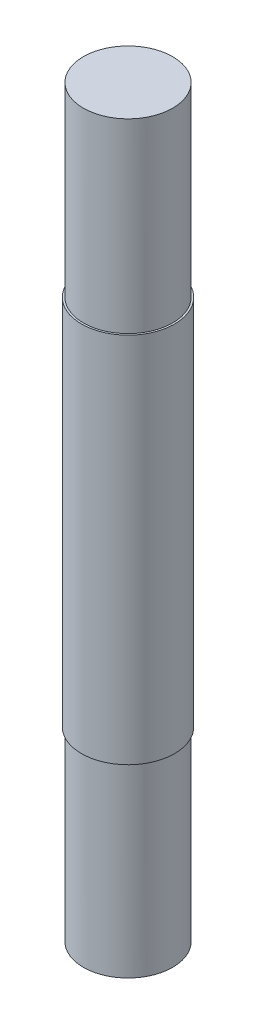
ISO-10303-21;
HEADER;
FILE_DESCRIPTION(('STEP AP214'),'2;1');
FILE_NAME('part.step','',(''),(''),'','','');
FILE_SCHEMA(('AUTOMOTIVE_DESIGN { 1 0 10303 214 1 1 1 1 }'));
ENDSEC;
DATA;
#1=APPLICATION_CONTEXT('core data for automotive mechanical design processes');
#2=APPLICATION_PROTOCOL_DEFINITION('international standard','automotive_design',2000,#1);
#3=PRODUCT_CONTEXT('',#1,'mechanical');
#4=PRODUCT('Part','Part','',(#3));
#5=PRODUCT_RELATED_PRODUCT_CATEGORY('part','',(#4));
#6=PRODUCT_DEFINITION_FORMATION('','',#4);
#7=PRODUCT_DEFINITION_CONTEXT('part definition',#1,'design');
#8=PRODUCT_DEFINITION('design','',#6,#7);
#9=PRODUCT_DEFINITION_SHAPE('','',#8);
#10=(LENGTH_UNIT() NAMED_UNIT(*) SI_UNIT(.MILLI.,.METRE.));
#11=(NAMED_UNIT(*) PLANE_ANGLE_UNIT() SI_UNIT($,.RADIAN.));
#12=(NAMED_UNIT(*) SI_UNIT($,.STERADIAN.) SOLID_ANGLE_UNIT());
#13=UNCERTAINTY_MEASURE_WITH_UNIT(LENGTH_MEASURE(1.E-05),#10,'distance_accuracy_value','');
#14=(GEOMETRIC_REPRESENTATION_CONTEXT(3) GLOBAL_UNCERTAINTY_ASSIGNED_CONTEXT((#13)) GLOBAL_UNIT_ASSIGNED_CONTEXT((#10,
#11,#12)) REPRESENTATION_CONTEXT('',''));
#15=CARTESIAN_POINT('',(0.,0.,0.));
#16=DIRECTION('',(0.,0.,1.));
#17=DIRECTION('',(1.,0.,0.));
#18=AXIS2_PLACEMENT_3D('',#15,#16,#17);
#19=CARTESIAN_POINT('',(0.,40.,0.));
#20=DIRECTION('',(0.,-1.,0.));
#21=DIRECTION('',(0.,0.,-1.));
#22=AXIS2_PLACEMENT_3D('',#19,#20,#21);
#23=CYLINDRICAL_SURFACE('',#22,2.4);
#24=CARTESIAN_POINT('',(0.,10.,0.));
#25=DIRECTION('',(0.,-1.,0.));
#26=DIRECTION('',(0.,0.,-1.));
#27=AXIS2_PLACEMENT_3D('',#24,#25,#26);
#28=CIRCLE('',#27,2.4);
#29=CARTESIAN_POINT('',(0.,10.,-2.4));
#30=VERTEX_POINT('',#29);
#31=EDGE_CURVE('E46',#30,#30,#28,.T.);
#32=ORIENTED_EDGE('',*,*,#31,.T.);
#33=EDGE_LOOP('',(#32));
#34=FACE_BOUND('',#33,.T.);
#35=CARTESIAN_POINT('',(0.,0.,0.));
#36=DIRECTION('',(0.,1.,0.));
#37=DIRECTION('',(0.,0.,1.));
#38=AXIS2_PLACEMENT_3D('',#35,#36,#37);
#39=CIRCLE('',#38,2.4);
#40=CARTESIAN_POINT('',(0.,0.,2.4));
#41=VERTEX_POINT('',#40);
#42=EDGE_CURVE('E56',#41,#41,#39,.T.);
#43=ORIENTED_EDGE('',*,*,#42,.T.);
#44=EDGE_LOOP('',(#43));
#45=FACE_BOUND('',#44,.T.);
#46=ADVANCED_FACE('F43',(#34,#45),#23,.T.);
#47=CARTESIAN_POINT('',(0.,0.,0.));
#48=DIRECTION('',(0.,1.,0.));
#49=DIRECTION('',(0.,0.,1.));
#50=AXIS2_PLACEMENT_3D('',#47,#48,#49);
#51=PLANE('',#50);
#52=ORIENTED_EDGE('',*,*,#42,.F.);
#53=EDGE_LOOP('',(#52));
#54=FACE_BOUND('',#53,.T.);
#55=ADVANCED_FACE('F88',(#54),#51,.F.);
#56=CARTESIAN_POINT('',(0.,10.,0.));
#57=DIRECTION('',(0.,1.,0.));
#58=DIRECTION('',(0.,0.,1.));
#59=AXIS2_PLACEMENT_3D('',#56,#57,#58);
#60=CYLINDRICAL_SURFACE('',#59,2.5);
#61=CARTESIAN_POINT('',(0.,10.,0.));
#62=DIRECTION('',(0.,-1.,0.));
#63=DIRECTION('',(0.,0.,-1.));
#64=AXIS2_PLACEMENT_3D('',#61,#62,#63);
#65=CIRCLE('',#64,2.5);
#66=CARTESIAN_POINT('',(0.,10.,-2.5));
#67=VERTEX_POINT('',#66);
#68=EDGE_CURVE('E66',#67,#67,#65,.T.);
#69=ORIENTED_EDGE('',*,*,#68,.F.);
#70=EDGE_LOOP('',(#69));
#71=FACE_BOUND('',#70,.T.);
#72=CARTESIAN_POINT('',(0.,30.,0.));
#73=DIRECTION('',(0.,-1.,0.));
#74=DIRECTION('',(0.,0.,-1.));
#75=AXIS2_PLACEMENT_3D('',#72,#73,#74);
#76=CIRCLE('',#75,2.5);
#77=CARTESIAN_POINT('',(0.,30.,-2.5));
#78=VERTEX_POINT('',#77);
#79=EDGE_CURVE('E62',#78,#78,#76,.T.);
#80=ORIENTED_EDGE('',*,*,#79,.T.);
#81=EDGE_LOOP('',(#80));
#82=FACE_BOUND('',#81,.T.);
#83=ADVANCED_FACE('F80',(#71,#82),#60,.T.);
#84=CARTESIAN_POINT('',(0.,10.,0.));
#85=DIRECTION('',(0.,-1.,0.));
#86=DIRECTION('',(0.,0.,-1.));
#87=AXIS2_PLACEMENT_3D('',#84,#85,#86);
#88=PLANE('',#87);
#89=ORIENTED_EDGE('',*,*,#31,.F.);
#90=EDGE_LOOP('',(#89));
#91=FACE_BOUND('',#90,.T.);
#92=ORIENTED_EDGE('',*,*,#68,.T.);
#93=EDGE_LOOP('',(#92));
#94=FACE_BOUND('',#93,.T.);
#95=ADVANCED_FACE('F77',(#91,#94),#88,.T.);
#96=CARTESIAN_POINT('',(0.,30.,0.));
#97=DIRECTION('',(0.,-1.,0.));
#98=DIRECTION('',(0.,0.,-1.));
#99=AXIS2_PLACEMENT_3D('',#96,#97,#98);
#100=PLANE('',#99);
#101=CARTESIAN_POINT('',(0.,30.,0.));
#102=DIRECTION('',(0.,-1.,0.));
#103=DIRECTION('',(0.,0.,-1.));
#104=AXIS2_PLACEMENT_3D('',#101,#102,#103);
#105=CIRCLE('',#104,2.4);
#106=CARTESIAN_POINT('',(0.,30.,-2.4));
#107=VERTEX_POINT('',#106);
#108=EDGE_CURVE('E10',#107,#107,#105,.T.);
#109=ORIENTED_EDGE('',*,*,#108,.T.);
#110=EDGE_LOOP('',(#109));
#111=FACE_BOUND('',#110,.T.);
#112=ORIENTED_EDGE('',*,*,#79,.F.);
#113=EDGE_LOOP('',(#112));
#114=FACE_BOUND('',#113,.T.);
#115=ADVANCED_FACE('F79',(#111,#114),#100,.F.);
#116=CARTESIAN_POINT('',(0.,40.,0.));
#117=DIRECTION('',(0.,1.,0.));
#118=DIRECTION('',(0.,0.,1.));
#119=AXIS2_PLACEMENT_3D('',#116,#117,#118);
#120=PLANE('',#119);
#121=CARTESIAN_POINT('',(0.,40.,0.));
#122=DIRECTION('',(0.,1.,0.));
#123=DIRECTION('',(0.,0.,1.));
#124=AXIS2_PLACEMENT_3D('',#121,#122,#123);
#125=CIRCLE('',#124,2.4);
#126=CARTESIAN_POINT('',(0.,40.,2.4));
#127=VERTEX_POINT('',#126);
#128=EDGE_CURVE('E51',#127,#127,#125,.T.);
#129=ORIENTED_EDGE('',*,*,#128,.T.);
#130=EDGE_LOOP('',(#129));
#131=FACE_BOUND('',#130,.T.);
#132=ADVANCED_FACE('F86',(#131),#120,.T.);
#133=ORIENTED_EDGE('',*,*,#128,.F.);
#134=EDGE_LOOP('',(#133));
#135=FACE_BOUND('',#134,.T.);
#136=ORIENTED_EDGE('',*,*,#108,.F.);
#137=EDGE_LOOP('',(#136));
#138=FACE_BOUND('',#137,.T.);
#139=ADVANCED_FACE('F92',(#135,#138),#23,.T.);
#140=CLOSED_SHELL('',(#46,#55,#83,#95,#115,#132,#139));
#141=MANIFOLD_SOLID_BREP('B2',#140);
#142=ADVANCED_BREP_SHAPE_REPRESENTATION('',(#18,#141),#14);
#143=SHAPE_DEFINITION_REPRESENTATION(#9,#142);
ENDSEC;
END-ISO-10303-21;
